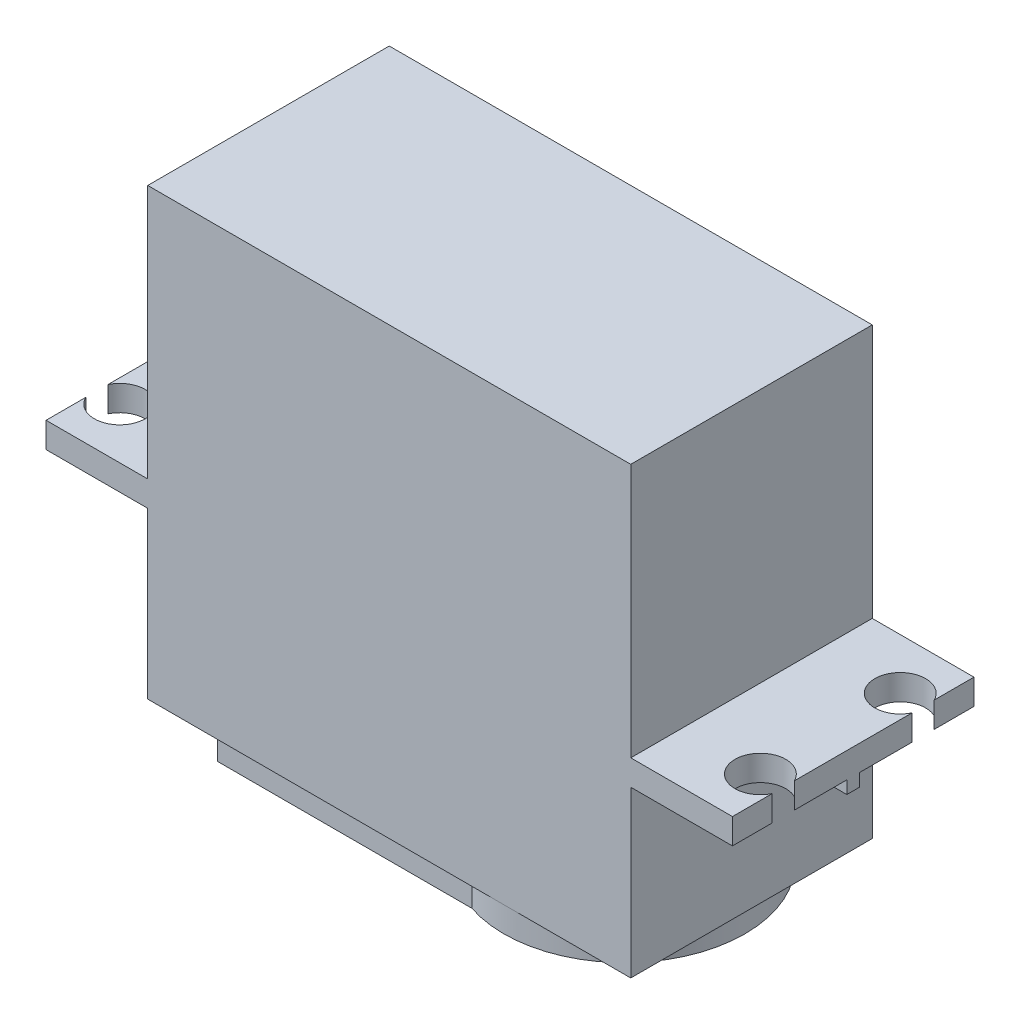
ISO-10303-21;
HEADER;
FILE_DESCRIPTION(('STEP AP214'),'2;1');
FILE_NAME('part.step','',(''),(''),'','','');
FILE_SCHEMA(('AUTOMOTIVE_DESIGN { 1 0 10303 214 1 1 1 1 }'));
ENDSEC;
DATA;
#1=APPLICATION_CONTEXT('core data for automotive mechanical design processes');
#2=APPLICATION_PROTOCOL_DEFINITION('international standard','automotive_design',2000,#1);
#3=PRODUCT_CONTEXT('',#1,'mechanical');
#4=PRODUCT('Part','Part','',(#3));
#5=PRODUCT_RELATED_PRODUCT_CATEGORY('part','',(#4));
#6=PRODUCT_DEFINITION_FORMATION('','',#4);
#7=PRODUCT_DEFINITION_CONTEXT('part definition',#1,'design');
#8=PRODUCT_DEFINITION('design','',#6,#7);
#9=PRODUCT_DEFINITION_SHAPE('','',#8);
#10=(LENGTH_UNIT() NAMED_UNIT(*) SI_UNIT(.MILLI.,.METRE.));
#11=(NAMED_UNIT(*) PLANE_ANGLE_UNIT() SI_UNIT($,.RADIAN.));
#12=(NAMED_UNIT(*) SI_UNIT($,.STERADIAN.) SOLID_ANGLE_UNIT());
#13=UNCERTAINTY_MEASURE_WITH_UNIT(LENGTH_MEASURE(1.E-05),#10,'distance_accuracy_value','');
#14=(GEOMETRIC_REPRESENTATION_CONTEXT(3) GLOBAL_UNCERTAINTY_ASSIGNED_CONTEXT((#13)) GLOBAL_UNIT_ASSIGNED_CONTEXT((#10,
#11,#12)) REPRESENTATION_CONTEXT('',''));
#15=CARTESIAN_POINT('',(0.,0.,0.));
#16=DIRECTION('',(0.,0.,1.));
#17=DIRECTION('',(1.,0.,0.));
#18=AXIS2_PLACEMENT_3D('',#15,#16,#17);
#19=CARTESIAN_POINT('',(19.,0.,19.));
#20=DIRECTION('',(0.,1.,0.));
#21=DIRECTION('',(0.,0.,1.));
#22=AXIS2_PLACEMENT_3D('',#19,#20,#21);
#23=PLANE('',#22);
#24=DIRECTION('',(1.,0.,0.));
#25=VECTOR('',#24,1.);
#26=CARTESIAN_POINT('',(19.,0.,0.));
#27=LINE('',#26,#25);
#28=CARTESIAN_POINT('',(-19.,0.,0.));
#29=VERTEX_POINT('',#28);
#30=CARTESIAN_POINT('',(19.,0.,0.));
#31=VERTEX_POINT('',#30);
#32=EDGE_CURVE('E407',#29,#31,#27,.T.);
#33=ORIENTED_EDGE('',*,*,#32,.T.);
#34=DIRECTION('',(0.,0.,-1.));
#35=VECTOR('',#34,1.);
#36=CARTESIAN_POINT('',(19.,0.,19.));
#37=LINE('',#36,#35);
#38=CARTESIAN_POINT('',(19.,0.,19.));
#39=VERTEX_POINT('',#38);
#40=EDGE_CURVE('E445',#39,#31,#37,.T.);
#41=ORIENTED_EDGE('',*,*,#40,.F.);
#42=DIRECTION('',(1.,0.,0.));
#43=VECTOR('',#42,1.);
#44=CARTESIAN_POINT('',(19.,0.,19.));
#45=LINE('',#44,#43);
#46=CARTESIAN_POINT('',(-19.,0.,19.));
#47=VERTEX_POINT('',#46);
#48=EDGE_CURVE('E379',#47,#39,#45,.T.);
#49=ORIENTED_EDGE('',*,*,#48,.F.);
#50=DIRECTION('',(0.,0.,-1.));
#51=VECTOR('',#50,1.);
#52=CARTESIAN_POINT('',(-19.,0.,19.));
#53=LINE('',#52,#51);
#54=EDGE_CURVE('E448',#47,#29,#53,.T.);
#55=ORIENTED_EDGE('',*,*,#54,.T.);
#56=EDGE_LOOP('',(#33,#41,#49,#55));
#57=FACE_BOUND('',#56,.T.);
#58=DIRECTION('',(0.,0.,-1.));
#59=VECTOR('',#58,1.);
#60=CARTESIAN_POINT('',(-14.,0.,18.5));
#61=LINE('',#60,#59);
#62=CARTESIAN_POINT('',(-14.,0.,18.5));
#63=VERTEX_POINT('',#62);
#64=CARTESIAN_POINT('',(-14.,0.,0.5));
#65=VERTEX_POINT('',#64);
#66=EDGE_CURVE('E268',#63,#65,#61,.T.);
#67=ORIENTED_EDGE('',*,*,#66,.F.);
#68=DIRECTION('',(-1.,0.,0.));
#69=VECTOR('',#68,1.);
#70=CARTESIAN_POINT('',(-14.,0.,18.5));
#71=LINE('',#70,#69);
#72=CARTESIAN_POINT('',(6.,0.,18.5));
#73=VERTEX_POINT('',#72);
#74=EDGE_CURVE('E265',#73,#63,#71,.T.);
#75=ORIENTED_EDGE('',*,*,#74,.F.);
#76=CARTESIAN_POINT('',(9.,0.,9.5));
#77=DIRECTION('',(0.,-1.,0.));
#78=DIRECTION('',(0.,0.,1.));
#79=AXIS2_PLACEMENT_3D('',#76,#77,#78);
#80=CIRCLE('',#79,9.48683298050514);
#81=CARTESIAN_POINT('',(6.,0.,0.5));
#82=VERTEX_POINT('',#81);
#83=EDGE_CURVE('E59',#82,#73,#80,.T.);
#84=ORIENTED_EDGE('',*,*,#83,.F.);
#85=DIRECTION('',(1.,0.,0.));
#86=VECTOR('',#85,1.);
#87=CARTESIAN_POINT('',(-14.,0.,0.5));
#88=LINE('',#87,#86);
#89=EDGE_CURVE('E54',#65,#82,#88,.T.);
#90=ORIENTED_EDGE('',*,*,#89,.F.);
#91=EDGE_LOOP('',(#67,#75,#84,#90));
#92=FACE_BOUND('',#91,.T.);
#93=ADVANCED_FACE('F39',(#57,#92),#23,.F.);
#94=CARTESIAN_POINT('',(19.,0.,19.));
#95=DIRECTION('',(-1.,0.,0.));
#96=DIRECTION('',(0.,0.,1.));
#97=AXIS2_PLACEMENT_3D('',#94,#95,#96);
#98=PLANE('',#97);
#99=DIRECTION('',(0.,1.,0.));
#100=VECTOR('',#99,1.);
#101=CARTESIAN_POINT('',(19.,12.,8.99999999999999));
#102=LINE('',#101,#100);
#103=CARTESIAN_POINT('',(19.,12.,8.99999999999999));
#104=VERTEX_POINT('',#103);
#105=CARTESIAN_POINT('',(19.,13.,8.99999999999999));
#106=VERTEX_POINT('',#105);
#107=EDGE_CURVE('E299',#104,#106,#102,.T.);
#108=ORIENTED_EDGE('',*,*,#107,.F.);
#109=DIRECTION('',(0.,0.,-1.));
#110=VECTOR('',#109,1.);
#111=CARTESIAN_POINT('',(19.,12.,9.99999999999999));
#112=LINE('',#111,#110);
#113=CARTESIAN_POINT('',(19.,12.,9.99999999999999));
#114=VERTEX_POINT('',#113);
#115=EDGE_CURVE('E278',#114,#104,#112,.T.);
#116=ORIENTED_EDGE('',*,*,#115,.F.);
#117=DIRECTION('',(0.,1.,0.));
#118=VECTOR('',#117,1.);
#119=CARTESIAN_POINT('',(19.,12.,9.99999999999999));
#120=LINE('',#119,#118);
#121=CARTESIAN_POINT('',(19.,13.,9.99999999999999));
#122=VERTEX_POINT('',#121);
#123=EDGE_CURVE('E287',#114,#122,#120,.T.);
#124=ORIENTED_EDGE('',*,*,#123,.T.);
#125=DIRECTION('',(0.,0.,-1.));
#126=VECTOR('',#125,1.);
#127=CARTESIAN_POINT('',(19.,13.,19.));
#128=LINE('',#127,#126);
#129=CARTESIAN_POINT('',(19.,13.,19.));
#130=VERTEX_POINT('',#129);
#131=EDGE_CURVE('E443',#130,#122,#128,.T.);
#132=ORIENTED_EDGE('',*,*,#131,.F.);
#133=DIRECTION('',(0.,1.,0.));
#134=VECTOR('',#133,1.);
#135=CARTESIAN_POINT('',(19.,0.,19.));
#136=LINE('',#135,#134);
#137=EDGE_CURVE('E381',#39,#130,#136,.T.);
#138=ORIENTED_EDGE('',*,*,#137,.F.);
#139=ORIENTED_EDGE('',*,*,#40,.T.);
#140=DIRECTION('',(0.,1.,0.));
#141=VECTOR('',#140,1.);
#142=CARTESIAN_POINT('',(19.,0.,0.));
#143=LINE('',#142,#141);
#144=CARTESIAN_POINT('',(19.,13.,0.));
#145=VERTEX_POINT('',#144);
#146=EDGE_CURVE('E409',#31,#145,#143,.T.);
#147=ORIENTED_EDGE('',*,*,#146,.T.);
#148=EDGE_CURVE('E440',#106,#145,#128,.T.);
#149=ORIENTED_EDGE('',*,*,#148,.F.);
#150=EDGE_LOOP('',(#108,#116,#124,#132,#138,#139,#147,#149));
#151=FACE_BOUND('',#150,.T.);
#152=ADVANCED_FACE('F562',(#151),#98,.F.);
#153=CARTESIAN_POINT('',(19.,13.,19.));
#154=DIRECTION('',(0.,1.,0.));
#155=DIRECTION('',(-1.,0.,0.));
#156=AXIS2_PLACEMENT_3D('',#153,#154,#155);
#157=PLANE('',#156);
#158=DIRECTION('',(1.,0.,0.));
#159=VECTOR('',#158,1.);
#160=CARTESIAN_POINT('',(19.,13.,8.99999999999999));
#161=LINE('',#160,#159);
#162=CARTESIAN_POINT('',(27.,13.,8.99999999999999));
#163=VERTEX_POINT('',#162);
#164=EDGE_CURVE('E269',#106,#163,#161,.T.);
#165=ORIENTED_EDGE('',*,*,#164,.F.);
#166=ORIENTED_EDGE('',*,*,#148,.T.);
#167=DIRECTION('',(1.,0.,0.));
#168=VECTOR('',#167,1.);
#169=CARTESIAN_POINT('',(19.,13.,0.));
#170=LINE('',#169,#168);
#171=CARTESIAN_POINT('',(27.,13.,0.));
#172=VERTEX_POINT('',#171);
#173=EDGE_CURVE('E412',#145,#172,#170,.T.);
#174=ORIENTED_EDGE('',*,*,#173,.T.);
#175=DIRECTION('',(0.,0.,-1.));
#176=VECTOR('',#175,1.);
#177=CARTESIAN_POINT('',(27.,13.,19.));
#178=LINE('',#177,#176);
#179=CARTESIAN_POINT('',(27.,13.,3.12822021129187));
#180=VERTEX_POINT('',#179);
#181=EDGE_CURVE('E435',#180,#172,#178,.T.);
#182=ORIENTED_EDGE('',*,*,#181,.F.);
#183=CARTESIAN_POINT('',(25.2,13.,4.));
#184=DIRECTION('',(0.,1.,0.));
#185=DIRECTION('',(-1.,0.,0.));
#186=AXIS2_PLACEMENT_3D('',#183,#184,#185);
#187=CIRCLE('',#186,2.);
#188=CARTESIAN_POINT('',(27.,13.,4.87177978870814));
#189=VERTEX_POINT('',#188);
#190=EDGE_CURVE('E339',#180,#189,#187,.T.);
#191=ORIENTED_EDGE('',*,*,#190,.T.);
#192=EDGE_CURVE('E442',#163,#189,#178,.T.);
#193=ORIENTED_EDGE('',*,*,#192,.F.);
#194=EDGE_LOOP('',(#165,#166,#174,#182,#191,#193));
#195=FACE_BOUND('',#194,.T.);
#196=ADVANCED_FACE('F559',(#195),#157,.F.);
#197=DIRECTION('',(-1.,0.,0.));
#198=VECTOR('',#197,1.);
#199=CARTESIAN_POINT('',(19.,13.,9.99999999999999));
#200=LINE('',#199,#198);
#201=CARTESIAN_POINT('',(27.,13.,9.99999999999999));
#202=VERTEX_POINT('',#201);
#203=EDGE_CURVE('E272',#202,#122,#200,.T.);
#204=ORIENTED_EDGE('',*,*,#203,.F.);
#205=CARTESIAN_POINT('',(27.,13.,14.1282202112919));
#206=VERTEX_POINT('',#205);
#207=EDGE_CURVE('E441',#206,#202,#178,.T.);
#208=ORIENTED_EDGE('',*,*,#207,.F.);
#209=CARTESIAN_POINT('',(25.2,13.,15.));
#210=DIRECTION('',(0.,1.,0.));
#211=DIRECTION('',(-1.,0.,0.));
#212=AXIS2_PLACEMENT_3D('',#209,#210,#211);
#213=CIRCLE('',#212,2.);
#214=CARTESIAN_POINT('',(27.,13.,15.8717797887081));
#215=VERTEX_POINT('',#214);
#216=EDGE_CURVE('E360',#206,#215,#213,.T.);
#217=ORIENTED_EDGE('',*,*,#216,.T.);
#218=CARTESIAN_POINT('',(27.,13.,19.));
#219=VERTEX_POINT('',#218);
#220=EDGE_CURVE('E437',#219,#215,#178,.T.);
#221=ORIENTED_EDGE('',*,*,#220,.F.);
#222=DIRECTION('',(1.,0.,0.));
#223=VECTOR('',#222,1.);
#224=CARTESIAN_POINT('',(19.,13.,19.));
#225=LINE('',#224,#223);
#226=EDGE_CURVE('E383',#130,#219,#225,.T.);
#227=ORIENTED_EDGE('',*,*,#226,.F.);
#228=ORIENTED_EDGE('',*,*,#131,.T.);
#229=EDGE_LOOP('',(#204,#208,#217,#221,#227,#228));
#230=FACE_BOUND('',#229,.T.);
#231=ADVANCED_FACE('F567',(#230),#157,.F.);
#232=CARTESIAN_POINT('',(-19.,13.,19.));
#233=DIRECTION('',(0.,1.,0.));
#234=DIRECTION('',(-1.,0.,0.));
#235=AXIS2_PLACEMENT_3D('',#232,#233,#234);
#236=PLANE('',#235);
#237=DIRECTION('',(-1.,0.,0.));
#238=VECTOR('',#237,1.);
#239=CARTESIAN_POINT('',(-19.,13.,10.));
#240=LINE('',#239,#238);
#241=CARTESIAN_POINT('',(-19.,13.,10.));
#242=VERTEX_POINT('',#241);
#243=CARTESIAN_POINT('',(-27.,13.,10.));
#244=VERTEX_POINT('',#243);
#245=EDGE_CURVE('E302',#242,#244,#240,.T.);
#246=ORIENTED_EDGE('',*,*,#245,.F.);
#247=DIRECTION('',(0.,0.,-1.));
#248=VECTOR('',#247,1.);
#249=CARTESIAN_POINT('',(-19.,13.,19.));
#250=LINE('',#249,#248);
#251=CARTESIAN_POINT('',(-19.,13.,19.));
#252=VERTEX_POINT('',#251);
#253=EDGE_CURVE('E452',#252,#242,#250,.T.);
#254=ORIENTED_EDGE('',*,*,#253,.F.);
#255=DIRECTION('',(1.,0.,0.));
#256=VECTOR('',#255,1.);
#257=CARTESIAN_POINT('',(-19.,13.,19.));
#258=LINE('',#257,#256);
#259=CARTESIAN_POINT('',(-27.,13.,19.));
#260=VERTEX_POINT('',#259);
#261=EDGE_CURVE('E375',#260,#252,#258,.T.);
#262=ORIENTED_EDGE('',*,*,#261,.F.);
#263=DIRECTION('',(0.,0.,-1.));
#264=VECTOR('',#263,1.);
#265=CARTESIAN_POINT('',(-27.,13.,19.));
#266=LINE('',#265,#264);
#267=CARTESIAN_POINT('',(-27.,13.,15.8717797887081));
#268=VERTEX_POINT('',#267);
#269=EDGE_CURVE('E456',#260,#268,#266,.T.);
#270=ORIENTED_EDGE('',*,*,#269,.T.);
#271=CARTESIAN_POINT('',(-25.2,13.,15.));
#272=DIRECTION('',(0.,1.,0.));
#273=DIRECTION('',(-1.,0.,0.));
#274=AXIS2_PLACEMENT_3D('',#271,#272,#273);
#275=CIRCLE('',#274,2.);
#276=CARTESIAN_POINT('',(-27.,13.,14.1282202112919));
#277=VERTEX_POINT('',#276);
#278=EDGE_CURVE('E47',#268,#277,#275,.T.);
#279=ORIENTED_EDGE('',*,*,#278,.T.);
#280=EDGE_CURVE('E460',#277,#244,#266,.T.);
#281=ORIENTED_EDGE('',*,*,#280,.T.);
#282=EDGE_LOOP('',(#246,#254,#262,#270,#279,#281));
#283=FACE_BOUND('',#282,.T.);
#284=ADVANCED_FACE('F474',(#283),#236,.F.);
#285=DIRECTION('',(1.,0.,0.));
#286=VECTOR('',#285,1.);
#287=CARTESIAN_POINT('',(-19.,13.,9.));
#288=LINE('',#287,#286);
#289=CARTESIAN_POINT('',(-27.,13.,9.));
#290=VERTEX_POINT('',#289);
#291=CARTESIAN_POINT('',(-19.,13.,9.));
#292=VERTEX_POINT('',#291);
#293=EDGE_CURVE('E307',#290,#292,#288,.T.);
#294=ORIENTED_EDGE('',*,*,#293,.F.);
#295=CARTESIAN_POINT('',(-27.,13.,4.87177978870813));
#296=VERTEX_POINT('',#295);
#297=EDGE_CURVE('E461',#290,#296,#266,.T.);
#298=ORIENTED_EDGE('',*,*,#297,.T.);
#299=CARTESIAN_POINT('',(-25.2,13.,4.));
#300=DIRECTION('',(0.,1.,0.));
#301=DIRECTION('',(-1.,0.,0.));
#302=AXIS2_PLACEMENT_3D('',#299,#300,#301);
#303=CIRCLE('',#302,2.);
#304=CARTESIAN_POINT('',(-27.,13.,3.12822021129187));
#305=VERTEX_POINT('',#304);
#306=EDGE_CURVE('E11',#296,#305,#303,.T.);
#307=ORIENTED_EDGE('',*,*,#306,.T.);
#308=CARTESIAN_POINT('',(-27.,13.,0.));
#309=VERTEX_POINT('',#308);
#310=EDGE_CURVE('E455',#305,#309,#266,.T.);
#311=ORIENTED_EDGE('',*,*,#310,.T.);
#312=DIRECTION('',(1.,0.,0.));
#313=VECTOR('',#312,1.);
#314=CARTESIAN_POINT('',(-19.,13.,0.));
#315=LINE('',#314,#313);
#316=CARTESIAN_POINT('',(-19.,13.,0.));
#317=VERTEX_POINT('',#316);
#318=EDGE_CURVE('E402',#309,#317,#315,.T.);
#319=ORIENTED_EDGE('',*,*,#318,.T.);
#320=EDGE_CURVE('E451',#292,#317,#250,.T.);
#321=ORIENTED_EDGE('',*,*,#320,.F.);
#322=EDGE_LOOP('',(#294,#298,#307,#311,#319,#321));
#323=FACE_BOUND('',#322,.T.);
#324=ADVANCED_FACE('F485',(#323),#236,.F.);
#325=CARTESIAN_POINT('',(-19.,0.,19.));
#326=DIRECTION('',(1.,0.,0.));
#327=DIRECTION('',(0.,0.,-1.));
#328=AXIS2_PLACEMENT_3D('',#325,#326,#327);
#329=PLANE('',#328);
#330=DIRECTION('',(0.,1.,0.));
#331=VECTOR('',#330,1.);
#332=CARTESIAN_POINT('',(-19.,12.,10.));
#333=LINE('',#332,#331);
#334=CARTESIAN_POINT('',(-19.,12.,10.));
#335=VERTEX_POINT('',#334);
#336=EDGE_CURVE('E315',#335,#242,#333,.T.);
#337=ORIENTED_EDGE('',*,*,#336,.F.);
#338=DIRECTION('',(0.,0.,1.));
#339=VECTOR('',#338,1.);
#340=CARTESIAN_POINT('',(-19.,12.,10.));
#341=LINE('',#340,#339);
#342=CARTESIAN_POINT('',(-19.,12.,9.));
#343=VERTEX_POINT('',#342);
#344=EDGE_CURVE('E312',#343,#335,#341,.T.);
#345=ORIENTED_EDGE('',*,*,#344,.F.);
#346=DIRECTION('',(0.,1.,0.));
#347=VECTOR('',#346,1.);
#348=CARTESIAN_POINT('',(-19.,12.,9.));
#349=LINE('',#348,#347);
#350=EDGE_CURVE('E322',#343,#292,#349,.T.);
#351=ORIENTED_EDGE('',*,*,#350,.T.);
#352=ORIENTED_EDGE('',*,*,#320,.T.);
#353=DIRECTION('',(0.,-1.,0.));
#354=VECTOR('',#353,1.);
#355=CARTESIAN_POINT('',(-19.,0.,0.));
#356=LINE('',#355,#354);
#357=EDGE_CURVE('E405',#317,#29,#356,.T.);
#358=ORIENTED_EDGE('',*,*,#357,.T.);
#359=ORIENTED_EDGE('',*,*,#54,.F.);
#360=DIRECTION('',(0.,-1.,0.));
#361=VECTOR('',#360,1.);
#362=CARTESIAN_POINT('',(-19.,0.,19.));
#363=LINE('',#362,#361);
#364=EDGE_CURVE('E377',#252,#47,#363,.T.);
#365=ORIENTED_EDGE('',*,*,#364,.F.);
#366=ORIENTED_EDGE('',*,*,#253,.T.);
#367=EDGE_LOOP('',(#337,#345,#351,#352,#358,#359,#365,#366));
#368=FACE_BOUND('',#367,.T.);
#369=ADVANCED_FACE('F501',(#368),#329,.F.);
#370=CARTESIAN_POINT('',(-27.,13.,19.));
#371=DIRECTION('',(1.,0.,0.));
#372=DIRECTION('',(0.,0.,-1.));
#373=AXIS2_PLACEMENT_3D('',#370,#371,#372);
#374=PLANE('',#373);
#375=ORIENTED_EDGE('',*,*,#310,.F.);
#376=DIRECTION('',(0.,1.,0.));
#377=VECTOR('',#376,1.);
#378=CARTESIAN_POINT('',(-27.,0.,3.12822021129187));
#379=LINE('',#378,#377);
#380=CARTESIAN_POINT('',(-27.,15.,3.12822021129187));
#381=VERTEX_POINT('',#380);
#382=EDGE_CURVE('E354',#305,#381,#379,.T.);
#383=ORIENTED_EDGE('',*,*,#382,.T.);
#384=DIRECTION('',(0.,0.,-1.));
#385=VECTOR('',#384,1.);
#386=CARTESIAN_POINT('',(-27.,15.,19.));
#387=LINE('',#386,#385);
#388=CARTESIAN_POINT('',(-27.,15.,0.));
#389=VERTEX_POINT('',#388);
#390=EDGE_CURVE('E459',#381,#389,#387,.T.);
#391=ORIENTED_EDGE('',*,*,#390,.T.);
#392=DIRECTION('',(0.,-1.,0.));
#393=VECTOR('',#392,1.);
#394=CARTESIAN_POINT('',(-27.,13.,0.));
#395=LINE('',#394,#393);
#396=EDGE_CURVE('E399',#389,#309,#395,.T.);
#397=ORIENTED_EDGE('',*,*,#396,.T.);
#398=EDGE_LOOP('',(#375,#383,#391,#397));
#399=FACE_BOUND('',#398,.T.);
#400=ADVANCED_FACE('F492',(#399),#374,.F.);
#401=CARTESIAN_POINT('',(-27.,15.,14.1282202112919));
#402=VERTEX_POINT('',#401);
#403=CARTESIAN_POINT('',(-27.,15.,4.87177978870813));
#404=VERTEX_POINT('',#403);
#405=EDGE_CURVE('E466',#402,#404,#387,.T.);
#406=ORIENTED_EDGE('',*,*,#405,.T.);
#407=DIRECTION('',(0.,1.,0.));
#408=VECTOR('',#407,1.);
#409=CARTESIAN_POINT('',(-27.,0.,4.87177978870814));
#410=LINE('',#409,#408);
#411=EDGE_CURVE('E351',#404,#296,#410,.F.);
#412=ORIENTED_EDGE('',*,*,#411,.T.);
#413=ORIENTED_EDGE('',*,*,#297,.F.);
#414=DIRECTION('',(0.,1.,0.));
#415=VECTOR('',#414,1.);
#416=CARTESIAN_POINT('',(-27.,12.,9.));
#417=LINE('',#416,#415);
#418=CARTESIAN_POINT('',(-27.,12.,9.));
#419=VERTEX_POINT('',#418);
#420=EDGE_CURVE('E324',#419,#290,#417,.T.);
#421=ORIENTED_EDGE('',*,*,#420,.F.);
#422=DIRECTION('',(0.,0.,-1.));
#423=VECTOR('',#422,1.);
#424=CARTESIAN_POINT('',(-27.,12.,9.));
#425=LINE('',#424,#423);
#426=CARTESIAN_POINT('',(-27.,12.,10.));
#427=VERTEX_POINT('',#426);
#428=EDGE_CURVE('E306',#427,#419,#425,.T.);
#429=ORIENTED_EDGE('',*,*,#428,.F.);
#430=DIRECTION('',(0.,1.,0.));
#431=VECTOR('',#430,1.);
#432=CARTESIAN_POINT('',(-27.,12.,10.));
#433=LINE('',#432,#431);
#434=EDGE_CURVE('E327',#427,#244,#433,.T.);
#435=ORIENTED_EDGE('',*,*,#434,.T.);
#436=ORIENTED_EDGE('',*,*,#280,.F.);
#437=DIRECTION('',(0.,1.,0.));
#438=VECTOR('',#437,1.);
#439=CARTESIAN_POINT('',(-27.,0.,14.1282202112919));
#440=LINE('',#439,#438);
#441=EDGE_CURVE('E348',#277,#402,#440,.T.);
#442=ORIENTED_EDGE('',*,*,#441,.T.);
#443=EDGE_LOOP('',(#406,#412,#413,#421,#429,#435,#436,#442));
#444=FACE_BOUND('',#443,.T.);
#445=ADVANCED_FACE('F480',(#444),#374,.F.);
#446=CARTESIAN_POINT('',(27.,13.,19.));
#447=DIRECTION('',(-1.,0.,0.));
#448=DIRECTION('',(0.,0.,1.));
#449=AXIS2_PLACEMENT_3D('',#446,#447,#448);
#450=PLANE('',#449);
#451=ORIENTED_EDGE('',*,*,#207,.T.);
#452=DIRECTION('',(0.,1.,0.));
#453=VECTOR('',#452,1.);
#454=CARTESIAN_POINT('',(27.,12.,9.99999999999999));
#455=LINE('',#454,#453);
#456=CARTESIAN_POINT('',(27.,12.,9.99999999999999));
#457=VERTEX_POINT('',#456);
#458=EDGE_CURVE('E293',#457,#202,#455,.T.);
#459=ORIENTED_EDGE('',*,*,#458,.F.);
#460=DIRECTION('',(0.,0.,1.));
#461=VECTOR('',#460,1.);
#462=CARTESIAN_POINT('',(27.,12.,8.99999999999999));
#463=LINE('',#462,#461);
#464=CARTESIAN_POINT('',(27.,12.,8.99999999999999));
#465=VERTEX_POINT('',#464);
#466=EDGE_CURVE('E283',#465,#457,#463,.T.);
#467=ORIENTED_EDGE('',*,*,#466,.F.);
#468=DIRECTION('',(0.,1.,0.));
#469=VECTOR('',#468,1.);
#470=CARTESIAN_POINT('',(27.,12.,8.99999999999999));
#471=LINE('',#470,#469);
#472=EDGE_CURVE('E296',#465,#163,#471,.T.);
#473=ORIENTED_EDGE('',*,*,#472,.T.);
#474=ORIENTED_EDGE('',*,*,#192,.T.);
#475=DIRECTION('',(0.,1.,0.));
#476=VECTOR('',#475,1.);
#477=CARTESIAN_POINT('',(27.,0.,4.87177978870814));
#478=LINE('',#477,#476);
#479=CARTESIAN_POINT('',(27.,15.,4.87177978870814));
#480=VERTEX_POINT('',#479);
#481=EDGE_CURVE('E342',#189,#480,#478,.T.);
#482=ORIENTED_EDGE('',*,*,#481,.T.);
#483=DIRECTION('',(0.,0.,-1.));
#484=VECTOR('',#483,1.);
#485=CARTESIAN_POINT('',(27.,15.,19.));
#486=LINE('',#485,#484);
#487=CARTESIAN_POINT('',(27.,15.,14.1282202112919));
#488=VERTEX_POINT('',#487);
#489=EDGE_CURVE('E436',#488,#480,#486,.T.);
#490=ORIENTED_EDGE('',*,*,#489,.F.);
#491=DIRECTION('',(0.,1.,0.));
#492=VECTOR('',#491,1.);
#493=CARTESIAN_POINT('',(27.,0.,14.1282202112919));
#494=LINE('',#493,#492);
#495=EDGE_CURVE('E357',#488,#206,#494,.F.);
#496=ORIENTED_EDGE('',*,*,#495,.T.);
#497=EDGE_LOOP('',(#451,#459,#467,#473,#474,#482,#490,#496));
#498=FACE_BOUND('',#497,.T.);
#499=ADVANCED_FACE('F576',(#498),#450,.F.);
#500=ORIENTED_EDGE('',*,*,#220,.T.);
#501=DIRECTION('',(0.,1.,0.));
#502=VECTOR('',#501,1.);
#503=CARTESIAN_POINT('',(27.,0.,15.8717797887081));
#504=LINE('',#503,#502);
#505=CARTESIAN_POINT('',(27.,15.,15.8717797887081));
#506=VERTEX_POINT('',#505);
#507=EDGE_CURVE('E363',#215,#506,#504,.T.);
#508=ORIENTED_EDGE('',*,*,#507,.T.);
#509=CARTESIAN_POINT('',(27.,15.,19.));
#510=VERTEX_POINT('',#509);
#511=EDGE_CURVE('E432',#510,#506,#486,.T.);
#512=ORIENTED_EDGE('',*,*,#511,.F.);
#513=DIRECTION('',(0.,1.,0.));
#514=VECTOR('',#513,1.);
#515=CARTESIAN_POINT('',(27.,13.,19.));
#516=LINE('',#515,#514);
#517=EDGE_CURVE('E385',#219,#510,#516,.T.);
#518=ORIENTED_EDGE('',*,*,#517,.F.);
#519=EDGE_LOOP('',(#500,#508,#512,#518));
#520=FACE_BOUND('',#519,.T.);
#521=ADVANCED_FACE('F571',(#520),#450,.F.);
#522=CARTESIAN_POINT('',(-19.,15.,19.));
#523=DIRECTION('',(1.,0.,0.));
#524=DIRECTION('',(0.,0.,-1.));
#525=AXIS2_PLACEMENT_3D('',#522,#523,#524);
#526=PLANE('',#525);
#527=DIRECTION('',(0.,-1.,0.));
#528=VECTOR('',#527,1.);
#529=CARTESIAN_POINT('',(-19.,15.,0.));
#530=LINE('',#529,#528);
#531=CARTESIAN_POINT('',(-19.,35.,0.));
#532=VERTEX_POINT('',#531);
#533=CARTESIAN_POINT('',(-19.,15.,0.));
#534=VERTEX_POINT('',#533);
#535=EDGE_CURVE('E366',#532,#534,#530,.T.);
#536=ORIENTED_EDGE('',*,*,#535,.T.);
#537=DIRECTION('',(0.,0.,-1.));
#538=VECTOR('',#537,1.);
#539=CARTESIAN_POINT('',(-19.,15.,19.));
#540=LINE('',#539,#538);
#541=CARTESIAN_POINT('',(-19.,15.,19.));
#542=VERTEX_POINT('',#541);
#543=EDGE_CURVE('E465',#542,#534,#540,.T.);
#544=ORIENTED_EDGE('',*,*,#543,.F.);
#545=DIRECTION('',(0.,-1.,0.));
#546=VECTOR('',#545,1.);
#547=CARTESIAN_POINT('',(-19.,15.,19.));
#548=LINE('',#547,#546);
#549=CARTESIAN_POINT('',(-19.,35.,19.));
#550=VERTEX_POINT('',#549);
#551=EDGE_CURVE('E367',#550,#542,#548,.T.);
#552=ORIENTED_EDGE('',*,*,#551,.F.);
#553=DIRECTION('',(0.,0.,-1.));
#554=VECTOR('',#553,1.);
#555=CARTESIAN_POINT('',(-19.,35.,19.));
#556=LINE('',#555,#554);
#557=EDGE_CURVE('E393',#550,#532,#556,.T.);
#558=ORIENTED_EDGE('',*,*,#557,.T.);
#559=EDGE_LOOP('',(#536,#544,#552,#558));
#560=FACE_BOUND('',#559,.T.);
#561=ADVANCED_FACE('F41',(#560),#526,.F.);
#562=CARTESIAN_POINT('',(-27.,15.,19.));
#563=DIRECTION('',(0.,-1.,0.));
#564=DIRECTION('',(1.,0.,0.));
#565=AXIS2_PLACEMENT_3D('',#562,#563,#564);
#566=PLANE('',#565);
#567=ORIENTED_EDGE('',*,*,#390,.F.);
#568=CARTESIAN_POINT('',(-25.2,15.,4.));
#569=DIRECTION('',(0.,1.,0.));
#570=DIRECTION('',(-1.,0.,0.));
#571=AXIS2_PLACEMENT_3D('',#568,#569,#570);
#572=CIRCLE('',#571,2.);
#573=EDGE_CURVE('E334',#404,#381,#572,.T.);
#574=ORIENTED_EDGE('',*,*,#573,.F.);
#575=ORIENTED_EDGE('',*,*,#405,.F.);
#576=CARTESIAN_POINT('',(-25.2,15.,15.));
#577=DIRECTION('',(0.,1.,0.));
#578=DIRECTION('',(1.,0.,0.));
#579=AXIS2_PLACEMENT_3D('',#576,#577,#578);
#580=CIRCLE('',#579,2.);
#581=CARTESIAN_POINT('',(-27.,15.,15.8717797887081));
#582=VERTEX_POINT('',#581);
#583=EDGE_CURVE('E330',#582,#402,#580,.T.);
#584=ORIENTED_EDGE('',*,*,#583,.F.);
#585=CARTESIAN_POINT('',(-27.,15.,19.));
#586=VERTEX_POINT('',#585);
#587=EDGE_CURVE('E462',#586,#582,#387,.T.);
#588=ORIENTED_EDGE('',*,*,#587,.F.);
#589=DIRECTION('',(-1.,0.,0.));
#590=VECTOR('',#589,1.);
#591=CARTESIAN_POINT('',(-27.,15.,19.));
#592=LINE('',#591,#590);
#593=EDGE_CURVE('E370',#542,#586,#592,.T.);
#594=ORIENTED_EDGE('',*,*,#593,.F.);
#595=ORIENTED_EDGE('',*,*,#543,.T.);
#596=DIRECTION('',(-1.,0.,0.));
#597=VECTOR('',#596,1.);
#598=CARTESIAN_POINT('',(-27.,15.,0.));
#599=LINE('',#598,#597);
#600=EDGE_CURVE('E396',#534,#389,#599,.T.);
#601=ORIENTED_EDGE('',*,*,#600,.T.);
#602=EDGE_LOOP('',(#567,#574,#575,#584,#588,#594,#595,#601));
#603=FACE_BOUND('',#602,.T.);
#604=ADVANCED_FACE('F526',(#603),#566,.F.);
#605=ORIENTED_EDGE('',*,*,#587,.T.);
#606=DIRECTION('',(0.,1.,0.));
#607=VECTOR('',#606,1.);
#608=CARTESIAN_POINT('',(-27.,0.,15.8717797887081));
#609=LINE('',#608,#607);
#610=EDGE_CURVE('E345',#582,#268,#609,.F.);
#611=ORIENTED_EDGE('',*,*,#610,.T.);
#612=ORIENTED_EDGE('',*,*,#269,.F.);
#613=DIRECTION('',(0.,-1.,0.));
#614=VECTOR('',#613,1.);
#615=CARTESIAN_POINT('',(-27.,13.,19.));
#616=LINE('',#615,#614);
#617=EDGE_CURVE('E373',#586,#260,#616,.T.);
#618=ORIENTED_EDGE('',*,*,#617,.F.);
#619=EDGE_LOOP('',(#605,#611,#612,#618));
#620=FACE_BOUND('',#619,.T.);
#621=ADVANCED_FACE('F531',(#620),#374,.F.);
#622=CARTESIAN_POINT('',(27.,15.,3.12822021129186));
#623=VERTEX_POINT('',#622);
#624=CARTESIAN_POINT('',(27.,15.,0.));
#625=VERTEX_POINT('',#624);
#626=EDGE_CURVE('E431',#623,#625,#486,.T.);
#627=ORIENTED_EDGE('',*,*,#626,.F.);
#628=DIRECTION('',(0.,1.,0.));
#629=VECTOR('',#628,1.);
#630=CARTESIAN_POINT('',(27.,0.,3.12822021129187));
#631=LINE('',#630,#629);
#632=EDGE_CURVE('E333',#623,#180,#631,.F.);
#633=ORIENTED_EDGE('',*,*,#632,.T.);
#634=ORIENTED_EDGE('',*,*,#181,.T.);
#635=DIRECTION('',(0.,1.,0.));
#636=VECTOR('',#635,1.);
#637=CARTESIAN_POINT('',(27.,13.,0.));
#638=LINE('',#637,#636);
#639=EDGE_CURVE('E415',#172,#625,#638,.T.);
#640=ORIENTED_EDGE('',*,*,#639,.T.);
#641=EDGE_LOOP('',(#627,#633,#634,#640));
#642=FACE_BOUND('',#641,.T.);
#643=ADVANCED_FACE('F556',(#642),#450,.F.);
#644=CARTESIAN_POINT('',(27.,15.,19.));
#645=DIRECTION('',(0.,-1.,0.));
#646=DIRECTION('',(1.,0.,0.));
#647=AXIS2_PLACEMENT_3D('',#644,#645,#646);
#648=PLANE('',#647);
#649=ORIENTED_EDGE('',*,*,#489,.T.);
#650=CARTESIAN_POINT('',(25.2,15.,4.));
#651=DIRECTION('',(0.,1.,0.));
#652=DIRECTION('',(1.,0.,0.));
#653=AXIS2_PLACEMENT_3D('',#650,#651,#652);
#654=CIRCLE('',#653,2.);
#655=EDGE_CURVE('E331',#623,#480,#654,.T.);
#656=ORIENTED_EDGE('',*,*,#655,.F.);
#657=ORIENTED_EDGE('',*,*,#626,.T.);
#658=DIRECTION('',(-1.,0.,0.));
#659=VECTOR('',#658,1.);
#660=CARTESIAN_POINT('',(27.,15.,0.));
#661=LINE('',#660,#659);
#662=CARTESIAN_POINT('',(19.,15.,0.));
#663=VERTEX_POINT('',#662);
#664=EDGE_CURVE('E418',#625,#663,#661,.T.);
#665=ORIENTED_EDGE('',*,*,#664,.T.);
#666=DIRECTION('',(0.,0.,-1.));
#667=VECTOR('',#666,1.);
#668=CARTESIAN_POINT('',(19.,15.,19.));
#669=LINE('',#668,#667);
#670=CARTESIAN_POINT('',(19.,15.,19.));
#671=VERTEX_POINT('',#670);
#672=EDGE_CURVE('E428',#671,#663,#669,.T.);
#673=ORIENTED_EDGE('',*,*,#672,.F.);
#674=DIRECTION('',(-1.,0.,0.));
#675=VECTOR('',#674,1.);
#676=CARTESIAN_POINT('',(27.,15.,19.));
#677=LINE('',#676,#675);
#678=EDGE_CURVE('E387',#510,#671,#677,.T.);
#679=ORIENTED_EDGE('',*,*,#678,.F.);
#680=ORIENTED_EDGE('',*,*,#511,.T.);
#681=CARTESIAN_POINT('',(25.2,15.,15.));
#682=DIRECTION('',(0.,-1.,0.));
#683=DIRECTION('',(1.,0.,0.));
#684=AXIS2_PLACEMENT_3D('',#681,#682,#683);
#685=CIRCLE('',#684,2.);
#686=EDGE_CURVE('E469',#506,#488,#685,.T.);
#687=ORIENTED_EDGE('',*,*,#686,.T.);
#688=EDGE_LOOP('',(#649,#656,#657,#665,#673,#679,#680,#687));
#689=FACE_BOUND('',#688,.T.);
#690=ADVANCED_FACE('F550',(#689),#648,.F.);
#691=CARTESIAN_POINT('',(19.,15.,19.));
#692=DIRECTION('',(-1.,0.,0.));
#693=DIRECTION('',(0.,0.,1.));
#694=AXIS2_PLACEMENT_3D('',#691,#692,#693);
#695=PLANE('',#694);
#696=DIRECTION('',(0.,1.,0.));
#697=VECTOR('',#696,1.);
#698=CARTESIAN_POINT('',(19.,15.,0.));
#699=LINE('',#698,#697);
#700=CARTESIAN_POINT('',(19.,35.,0.));
#701=VERTEX_POINT('',#700);
#702=EDGE_CURVE('E420',#663,#701,#699,.T.);
#703=ORIENTED_EDGE('',*,*,#702,.T.);
#704=DIRECTION('',(0.,0.,-1.));
#705=VECTOR('',#704,1.);
#706=CARTESIAN_POINT('',(19.,35.,19.));
#707=LINE('',#706,#705);
#708=CARTESIAN_POINT('',(19.,35.,19.));
#709=VERTEX_POINT('',#708);
#710=EDGE_CURVE('E425',#709,#701,#707,.T.);
#711=ORIENTED_EDGE('',*,*,#710,.F.);
#712=DIRECTION('',(0.,1.,0.));
#713=VECTOR('',#712,1.);
#714=CARTESIAN_POINT('',(19.,15.,19.));
#715=LINE('',#714,#713);
#716=EDGE_CURVE('E389',#671,#709,#715,.T.);
#717=ORIENTED_EDGE('',*,*,#716,.F.);
#718=ORIENTED_EDGE('',*,*,#672,.T.);
#719=EDGE_LOOP('',(#703,#711,#717,#718));
#720=FACE_BOUND('',#719,.T.);
#721=ADVANCED_FACE('F545',(#720),#695,.F.);
#722=CARTESIAN_POINT('',(-19.,35.,19.));
#723=DIRECTION('',(0.,-1.,0.));
#724=DIRECTION('',(0.,0.,-1.));
#725=AXIS2_PLACEMENT_3D('',#722,#723,#724);
#726=PLANE('',#725);
#727=DIRECTION('',(-1.,0.,0.));
#728=VECTOR('',#727,1.);
#729=CARTESIAN_POINT('',(-19.,35.,0.));
#730=LINE('',#729,#728);
#731=EDGE_CURVE('E371',#701,#532,#730,.T.);
#732=ORIENTED_EDGE('',*,*,#731,.T.);
#733=ORIENTED_EDGE('',*,*,#557,.F.);
#734=DIRECTION('',(-1.,0.,0.));
#735=VECTOR('',#734,1.);
#736=CARTESIAN_POINT('',(-19.,35.,19.));
#737=LINE('',#736,#735);
#738=EDGE_CURVE('E391',#709,#550,#737,.T.);
#739=ORIENTED_EDGE('',*,*,#738,.F.);
#740=ORIENTED_EDGE('',*,*,#710,.T.);
#741=EDGE_LOOP('',(#732,#733,#739,#740));
#742=FACE_BOUND('',#741,.T.);
#743=ADVANCED_FACE('F540',(#742),#726,.F.);
#744=CARTESIAN_POINT('',(0.,0.,19.));
#745=DIRECTION('',(0.,0.,-1.));
#746=DIRECTION('',(-1.,0.,0.));
#747=AXIS2_PLACEMENT_3D('',#744,#745,#746);
#748=PLANE('',#747);
#749=ORIENTED_EDGE('',*,*,#551,.T.);
#750=ORIENTED_EDGE('',*,*,#593,.T.);
#751=ORIENTED_EDGE('',*,*,#617,.T.);
#752=ORIENTED_EDGE('',*,*,#261,.T.);
#753=ORIENTED_EDGE('',*,*,#364,.T.);
#754=ORIENTED_EDGE('',*,*,#48,.T.);
#755=ORIENTED_EDGE('',*,*,#137,.T.);
#756=ORIENTED_EDGE('',*,*,#226,.T.);
#757=ORIENTED_EDGE('',*,*,#517,.T.);
#758=ORIENTED_EDGE('',*,*,#678,.T.);
#759=ORIENTED_EDGE('',*,*,#716,.T.);
#760=ORIENTED_EDGE('',*,*,#738,.T.);
#761=EDGE_LOOP('',(#749,#750,#751,#752,#753,#754,#755,#756,#757,#758,#759,#760));
#762=FACE_BOUND('',#761,.T.);
#763=ADVANCED_FACE('F508',(#762),#748,.F.);
#764=CARTESIAN_POINT('',(0.,0.,0.));
#765=DIRECTION('',(0.,0.,-1.));
#766=DIRECTION('',(-1.,0.,0.));
#767=AXIS2_PLACEMENT_3D('',#764,#765,#766);
#768=PLANE('',#767);
#769=ORIENTED_EDGE('',*,*,#535,.F.);
#770=ORIENTED_EDGE('',*,*,#731,.F.);
#771=ORIENTED_EDGE('',*,*,#702,.F.);
#772=ORIENTED_EDGE('',*,*,#664,.F.);
#773=ORIENTED_EDGE('',*,*,#639,.F.);
#774=ORIENTED_EDGE('',*,*,#173,.F.);
#775=ORIENTED_EDGE('',*,*,#146,.F.);
#776=ORIENTED_EDGE('',*,*,#32,.F.);
#777=ORIENTED_EDGE('',*,*,#357,.F.);
#778=ORIENTED_EDGE('',*,*,#318,.F.);
#779=ORIENTED_EDGE('',*,*,#396,.F.);
#780=ORIENTED_EDGE('',*,*,#600,.F.);
#781=EDGE_LOOP('',(#769,#770,#771,#772,#773,#774,#775,#776,#777,#778,#779,#780));
#782=FACE_BOUND('',#781,.T.);
#783=ADVANCED_FACE('F496',(#782),#768,.T.);
#784=CARTESIAN_POINT('',(25.2,0.,15.));
#785=DIRECTION('',(0.,1.,0.));
#786=DIRECTION('',(-1.,0.,0.));
#787=AXIS2_PLACEMENT_3D('',#784,#785,#786);
#788=CYLINDRICAL_SURFACE('',#787,2.);
#789=ORIENTED_EDGE('',*,*,#216,.F.);
#790=ORIENTED_EDGE('',*,*,#495,.F.);
#791=ORIENTED_EDGE('',*,*,#686,.F.);
#792=ORIENTED_EDGE('',*,*,#507,.F.);
#793=EDGE_LOOP('',(#789,#790,#791,#792));
#794=FACE_BOUND('',#793,.T.);
#795=ADVANCED_FACE('F592',(#794),#788,.F.);
#796=CARTESIAN_POINT('',(25.2,0.,4.));
#797=DIRECTION('',(0.,1.,0.));
#798=DIRECTION('',(-1.,0.,0.));
#799=AXIS2_PLACEMENT_3D('',#796,#797,#798);
#800=CYLINDRICAL_SURFACE('',#799,2.);
#801=ORIENTED_EDGE('',*,*,#190,.F.);
#802=ORIENTED_EDGE('',*,*,#632,.F.);
#803=ORIENTED_EDGE('',*,*,#655,.T.);
#804=ORIENTED_EDGE('',*,*,#481,.F.);
#805=EDGE_LOOP('',(#801,#802,#803,#804));
#806=FACE_BOUND('',#805,.T.);
#807=ADVANCED_FACE('F580',(#806),#800,.F.);
#808=CARTESIAN_POINT('',(-25.2,0.,15.));
#809=DIRECTION('',(0.,1.,0.));
#810=DIRECTION('',(-1.,0.,0.));
#811=AXIS2_PLACEMENT_3D('',#808,#809,#810);
#812=CYLINDRICAL_SURFACE('',#811,2.);
#813=ORIENTED_EDGE('',*,*,#278,.F.);
#814=ORIENTED_EDGE('',*,*,#610,.F.);
#815=ORIENTED_EDGE('',*,*,#583,.T.);
#816=ORIENTED_EDGE('',*,*,#441,.F.);
#817=EDGE_LOOP('',(#813,#814,#815,#816));
#818=FACE_BOUND('',#817,.T.);
#819=ADVANCED_FACE('F599',(#818),#812,.F.);
#820=CARTESIAN_POINT('',(-25.2,0.,4.));
#821=DIRECTION('',(0.,1.,0.));
#822=DIRECTION('',(-1.,0.,0.));
#823=AXIS2_PLACEMENT_3D('',#820,#821,#822);
#824=CYLINDRICAL_SURFACE('',#823,2.);
#825=ORIENTED_EDGE('',*,*,#306,.F.);
#826=ORIENTED_EDGE('',*,*,#411,.F.);
#827=ORIENTED_EDGE('',*,*,#573,.T.);
#828=ORIENTED_EDGE('',*,*,#382,.F.);
#829=EDGE_LOOP('',(#825,#826,#827,#828));
#830=FACE_BOUND('',#829,.T.);
#831=ADVANCED_FACE('F523',(#830),#824,.F.);
#832=CARTESIAN_POINT('',(-19.,12.,10.));
#833=DIRECTION('',(0.,0.,-1.));
#834=DIRECTION('',(-1.,0.,0.));
#835=AXIS2_PLACEMENT_3D('',#832,#833,#834);
#836=PLANE('',#835);
#837=ORIENTED_EDGE('',*,*,#245,.T.);
#838=ORIENTED_EDGE('',*,*,#434,.F.);
#839=DIRECTION('',(-1.,0.,0.));
#840=VECTOR('',#839,1.);
#841=CARTESIAN_POINT('',(-19.,12.,10.));
#842=LINE('',#841,#840);
#843=EDGE_CURVE('E303',#335,#427,#842,.T.);
#844=ORIENTED_EDGE('',*,*,#843,.F.);
#845=ORIENTED_EDGE('',*,*,#336,.T.);
#846=EDGE_LOOP('',(#837,#838,#844,#845));
#847=FACE_BOUND('',#846,.T.);
#848=ADVANCED_FACE('F513',(#847),#836,.F.);
#849=CARTESIAN_POINT('',(-19.,12.,9.));
#850=DIRECTION('',(0.,0.,1.));
#851=DIRECTION('',(1.,0.,0.));
#852=AXIS2_PLACEMENT_3D('',#849,#850,#851);
#853=PLANE('',#852);
#854=ORIENTED_EDGE('',*,*,#293,.T.);
#855=ORIENTED_EDGE('',*,*,#350,.F.);
#856=DIRECTION('',(1.,0.,0.));
#857=VECTOR('',#856,1.);
#858=CARTESIAN_POINT('',(-19.,12.,9.));
#859=LINE('',#858,#857);
#860=EDGE_CURVE('E309',#419,#343,#859,.T.);
#861=ORIENTED_EDGE('',*,*,#860,.F.);
#862=ORIENTED_EDGE('',*,*,#420,.T.);
#863=EDGE_LOOP('',(#854,#855,#861,#862));
#864=FACE_BOUND('',#863,.T.);
#865=ADVANCED_FACE('F521',(#864),#853,.F.);
#866=CARTESIAN_POINT('',(0.,12.,0.));
#867=DIRECTION('',(0.,1.,0.));
#868=DIRECTION('',(-1.,0.,0.));
#869=AXIS2_PLACEMENT_3D('',#866,#867,#868);
#870=PLANE('',#869);
#871=ORIENTED_EDGE('',*,*,#843,.T.);
#872=ORIENTED_EDGE('',*,*,#428,.T.);
#873=ORIENTED_EDGE('',*,*,#860,.T.);
#874=ORIENTED_EDGE('',*,*,#344,.T.);
#875=EDGE_LOOP('',(#871,#872,#873,#874));
#876=FACE_BOUND('',#875,.T.);
#877=ADVANCED_FACE('F515',(#876),#870,.F.);
#878=CARTESIAN_POINT('',(19.,12.,8.99999999999999));
#879=DIRECTION('',(0.,0.,1.));
#880=DIRECTION('',(1.,0.,0.));
#881=AXIS2_PLACEMENT_3D('',#878,#879,#880);
#882=PLANE('',#881);
#883=ORIENTED_EDGE('',*,*,#164,.T.);
#884=ORIENTED_EDGE('',*,*,#472,.F.);
#885=DIRECTION('',(1.,0.,0.));
#886=VECTOR('',#885,1.);
#887=CARTESIAN_POINT('',(19.,12.,8.99999999999999));
#888=LINE('',#887,#886);
#889=EDGE_CURVE('E281',#104,#465,#888,.T.);
#890=ORIENTED_EDGE('',*,*,#889,.F.);
#891=ORIENTED_EDGE('',*,*,#107,.T.);
#892=EDGE_LOOP('',(#883,#884,#890,#891));
#893=FACE_BOUND('',#892,.T.);
#894=ADVANCED_FACE('F583',(#893),#882,.F.);
#895=CARTESIAN_POINT('',(19.,12.,9.99999999999999));
#896=DIRECTION('',(0.,0.,-1.));
#897=DIRECTION('',(-1.,0.,0.));
#898=AXIS2_PLACEMENT_3D('',#895,#896,#897);
#899=PLANE('',#898);
#900=ORIENTED_EDGE('',*,*,#203,.T.);
#901=ORIENTED_EDGE('',*,*,#123,.F.);
#902=DIRECTION('',(-1.,0.,0.));
#903=VECTOR('',#902,1.);
#904=CARTESIAN_POINT('',(19.,12.,9.99999999999999));
#905=LINE('',#904,#903);
#906=EDGE_CURVE('E285',#457,#114,#905,.T.);
#907=ORIENTED_EDGE('',*,*,#906,.F.);
#908=ORIENTED_EDGE('',*,*,#458,.T.);
#909=EDGE_LOOP('',(#900,#901,#907,#908));
#910=FACE_BOUND('',#909,.T.);
#911=ADVANCED_FACE('F591',(#910),#899,.F.);
#912=CARTESIAN_POINT('',(0.,12.,0.));
#913=DIRECTION('',(0.,-1.,0.));
#914=DIRECTION('',(1.,0.,0.));
#915=AXIS2_PLACEMENT_3D('',#912,#913,#914);
#916=PLANE('',#915);
#917=ORIENTED_EDGE('',*,*,#115,.T.);
#918=ORIENTED_EDGE('',*,*,#889,.T.);
#919=ORIENTED_EDGE('',*,*,#466,.T.);
#920=ORIENTED_EDGE('',*,*,#906,.T.);
#921=EDGE_LOOP('',(#917,#918,#919,#920));
#922=FACE_BOUND('',#921,.T.);
#923=ADVANCED_FACE('F589',(#922),#916,.T.);
#924=CARTESIAN_POINT('',(-14.,-2.,18.5));
#925=DIRECTION('',(1.,0.,0.));
#926=DIRECTION('',(0.,0.,-1.));
#927=AXIS2_PLACEMENT_3D('',#924,#925,#926);
#928=PLANE('',#927);
#929=ORIENTED_EDGE('',*,*,#66,.T.);
#930=DIRECTION('',(0.,1.,0.));
#931=VECTOR('',#930,1.);
#932=CARTESIAN_POINT('',(-14.,-2.,0.5));
#933=LINE('',#932,#931);
#934=CARTESIAN_POINT('',(-14.,-2.,0.5));
#935=VERTEX_POINT('',#934);
#936=EDGE_CURVE('E249',#935,#65,#933,.T.);
#937=ORIENTED_EDGE('',*,*,#936,.F.);
#938=DIRECTION('',(0.,0.,-1.));
#939=VECTOR('',#938,1.);
#940=CARTESIAN_POINT('',(-14.,-2.,18.5));
#941=LINE('',#940,#939);
#942=CARTESIAN_POINT('',(-14.,-2.,18.5));
#943=VERTEX_POINT('',#942);
#944=EDGE_CURVE('E256',#943,#935,#941,.T.);
#945=ORIENTED_EDGE('',*,*,#944,.F.);
#946=DIRECTION('',(0.,1.,0.));
#947=VECTOR('',#946,1.);
#948=CARTESIAN_POINT('',(-14.,-2.,18.5));
#949=LINE('',#948,#947);
#950=EDGE_CURVE('E814',#943,#63,#949,.T.);
#951=ORIENTED_EDGE('',*,*,#950,.T.);
#952=EDGE_LOOP('',(#929,#937,#945,#951));
#953=FACE_BOUND('',#952,.T.);
#954=ADVANCED_FACE('F267',(#953),#928,.F.);
#955=CARTESIAN_POINT('',(-14.,-2.,0.5));
#956=DIRECTION('',(0.,0.,1.));
#957=DIRECTION('',(1.,0.,0.));
#958=AXIS2_PLACEMENT_3D('',#955,#956,#957);
#959=PLANE('',#958);
#960=ORIENTED_EDGE('',*,*,#89,.T.);
#961=DIRECTION('',(0.,1.,0.));
#962=VECTOR('',#961,1.);
#963=CARTESIAN_POINT('',(6.,-2.,0.5));
#964=LINE('',#963,#962);
#965=CARTESIAN_POINT('',(6.,-2.,0.5));
#966=VERTEX_POINT('',#965);
#967=EDGE_CURVE('E252',#966,#82,#964,.T.);
#968=ORIENTED_EDGE('',*,*,#967,.F.);
#969=DIRECTION('',(1.,0.,0.));
#970=VECTOR('',#969,1.);
#971=CARTESIAN_POINT('',(-14.,-2.,0.5));
#972=LINE('',#971,#970);
#973=EDGE_CURVE('E245',#935,#966,#972,.T.);
#974=ORIENTED_EDGE('',*,*,#973,.F.);
#975=ORIENTED_EDGE('',*,*,#936,.T.);
#976=EDGE_LOOP('',(#960,#968,#974,#975));
#977=FACE_BOUND('',#976,.T.);
#978=ADVANCED_FACE('F247',(#977),#959,.F.);
#979=CARTESIAN_POINT('',(9.,-2.,9.5));
#980=DIRECTION('',(0.,1.,0.));
#981=DIRECTION('',(0.,0.,1.));
#982=AXIS2_PLACEMENT_3D('',#979,#980,#981);
#983=CYLINDRICAL_SURFACE('',#982,9.48683298050514);
#984=ORIENTED_EDGE('',*,*,#83,.T.);
#985=DIRECTION('',(0.,1.,0.));
#986=VECTOR('',#985,1.);
#987=CARTESIAN_POINT('',(6.,-2.,18.5));
#988=LINE('',#987,#986);
#989=CARTESIAN_POINT('',(6.,-2.,18.5));
#990=VERTEX_POINT('',#989);
#991=EDGE_CURVE('E274',#990,#73,#988,.T.);
#992=ORIENTED_EDGE('',*,*,#991,.F.);
#993=CARTESIAN_POINT('',(9.,-2.,9.5));
#994=DIRECTION('',(0.,-1.,0.));
#995=DIRECTION('',(0.,0.,1.));
#996=AXIS2_PLACEMENT_3D('',#993,#994,#995);
#997=CIRCLE('',#996,9.48683298050514);
#998=EDGE_CURVE('E255',#966,#990,#997,.T.);
#999=ORIENTED_EDGE('',*,*,#998,.F.);
#1000=ORIENTED_EDGE('',*,*,#967,.T.);
#1001=EDGE_LOOP('',(#984,#992,#999,#1000));
#1002=FACE_BOUND('',#1001,.T.);
#1003=ADVANCED_FACE('F764',(#1002),#983,.T.);
#1004=CARTESIAN_POINT('',(-14.,-2.,18.5));
#1005=DIRECTION('',(0.,0.,-1.));
#1006=DIRECTION('',(-1.,0.,0.));
#1007=AXIS2_PLACEMENT_3D('',#1004,#1005,#1006);
#1008=PLANE('',#1007);
#1009=ORIENTED_EDGE('',*,*,#74,.T.);
#1010=ORIENTED_EDGE('',*,*,#950,.F.);
#1011=DIRECTION('',(-1.,0.,0.));
#1012=VECTOR('',#1011,1.);
#1013=CARTESIAN_POINT('',(-14.,-2.,18.5));
#1014=LINE('',#1013,#1012);
#1015=EDGE_CURVE('E261',#990,#943,#1014,.T.);
#1016=ORIENTED_EDGE('',*,*,#1015,.F.);
#1017=ORIENTED_EDGE('',*,*,#991,.T.);
#1018=EDGE_LOOP('',(#1009,#1010,#1016,#1017));
#1019=FACE_BOUND('',#1018,.T.);
#1020=ADVANCED_FACE('F771',(#1019),#1008,.F.);
#1021=CARTESIAN_POINT('',(9.,-2.,9.5));
#1022=DIRECTION('',(0.,1.,0.));
#1023=DIRECTION('',(0.,0.,1.));
#1024=AXIS2_PLACEMENT_3D('',#1021,#1022,#1023);
#1025=PLANE('',#1024);
#1026=CARTESIAN_POINT('',(9.,-2.,9.5));
#1027=DIRECTION('',(0.,-1.,0.));
#1028=DIRECTION('',(0.,0.,-1.));
#1029=AXIS2_PLACEMENT_3D('',#1026,#1027,#1028);
#1030=CIRCLE('',#1029,3.);
#1031=CARTESIAN_POINT('',(9.,-2.,6.5));
#1032=VERTEX_POINT('',#1031);
#1033=EDGE_CURVE('E807',#1032,#1032,#1030,.T.);
#1034=ORIENTED_EDGE('',*,*,#1033,.F.);
#1035=EDGE_LOOP('',(#1034));
#1036=FACE_BOUND('',#1035,.T.);
#1037=ORIENTED_EDGE('',*,*,#944,.T.);
#1038=ORIENTED_EDGE('',*,*,#973,.T.);
#1039=ORIENTED_EDGE('',*,*,#998,.T.);
#1040=ORIENTED_EDGE('',*,*,#1015,.T.);
#1041=EDGE_LOOP('',(#1037,#1038,#1039,#1040));
#1042=FACE_BOUND('',#1041,.T.);
#1043=ADVANCED_FACE('F259',(#1036,#1042),#1025,.F.);
#1044=CARTESIAN_POINT('',(9.,3.,9.5));
#1045=DIRECTION('',(0.,-1.,0.));
#1046=DIRECTION('',(0.,0.,-1.));
#1047=AXIS2_PLACEMENT_3D('',#1044,#1045,#1046);
#1048=CYLINDRICAL_SURFACE('',#1047,3.);
#1049=CARTESIAN_POINT('',(9.,3.,9.5));
#1050=DIRECTION('',(0.,-1.,0.));
#1051=DIRECTION('',(0.,0.,-1.));
#1052=AXIS2_PLACEMENT_3D('',#1049,#1050,#1051);
#1053=CIRCLE('',#1052,3.);
#1054=CARTESIAN_POINT('',(9.,3.,6.5));
#1055=VERTEX_POINT('',#1054);
#1056=EDGE_CURVE('E806',#1055,#1055,#1053,.T.);
#1057=ORIENTED_EDGE('',*,*,#1056,.F.);
#1058=EDGE_LOOP('',(#1057));
#1059=FACE_BOUND('',#1058,.T.);
#1060=ORIENTED_EDGE('',*,*,#1033,.T.);
#1061=EDGE_LOOP('',(#1060));
#1062=FACE_BOUND('',#1061,.T.);
#1063=ADVANCED_FACE('F786',(#1059,#1062),#1048,.F.);
#1064=CARTESIAN_POINT('',(9.,3.,9.5));
#1065=DIRECTION('',(0.,-1.,0.));
#1066=DIRECTION('',(0.,0.,-1.));
#1067=AXIS2_PLACEMENT_3D('',#1064,#1065,#1066);
#1068=PLANE('',#1067);
#1069=ORIENTED_EDGE('',*,*,#1056,.T.);
#1070=EDGE_LOOP('',(#1069));
#1071=FACE_BOUND('',#1070,.T.);
#1072=ADVANCED_FACE('F794',(#1071),#1068,.T.);
#1073=CLOSED_SHELL('',(#93,#152,#196,#231,#284,#324,#369,#400,#445,#499,#521,#561,#604,#621,
#643,#690,#721,#743,#763,#783,#795,#807,#819,#831,#848,#865,#877,#894,#911,#923,#954,#978,#1003,
#1020,#1043,#1063,#1072));
#1074=MANIFOLD_SOLID_BREP('B2',#1073);
#1075=ADVANCED_BREP_SHAPE_REPRESENTATION('',(#18,#1074),#14);
#1076=SHAPE_DEFINITION_REPRESENTATION(#9,#1075);
ENDSEC;
END-ISO-10303-21;
